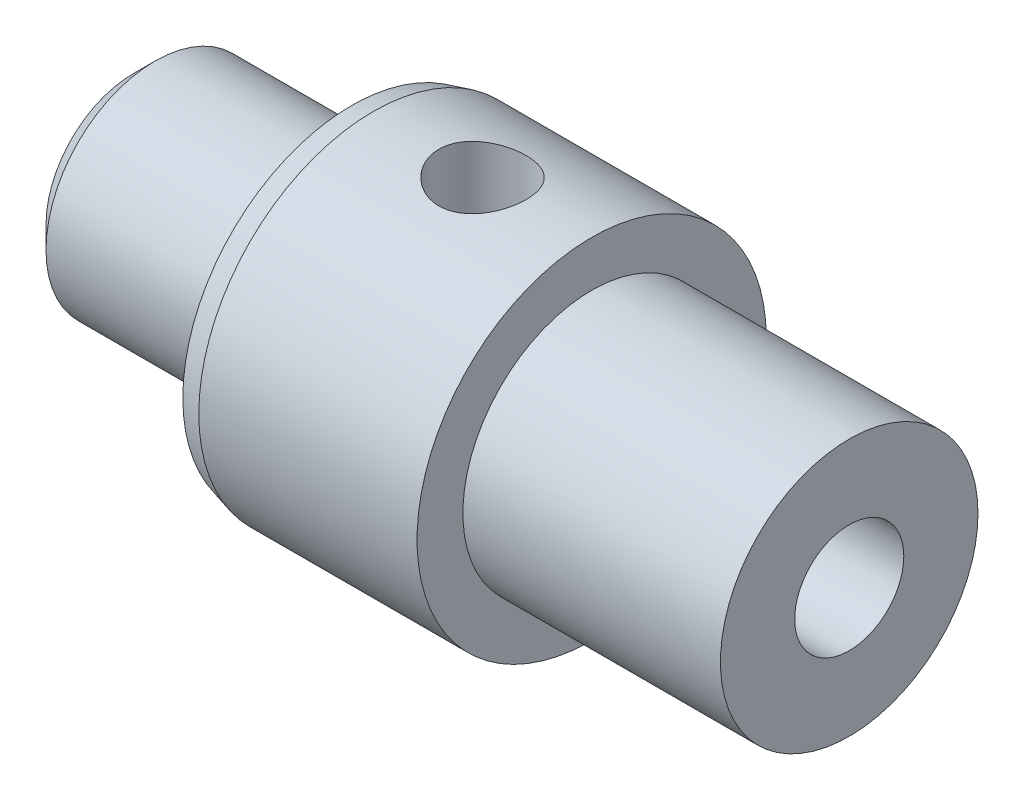
ISO-10303-21;
HEADER;
FILE_DESCRIPTION(('STEP AP214'),'2;1');
FILE_NAME('part.step','',(''),(''),'','','');
FILE_SCHEMA(('AUTOMOTIVE_DESIGN { 1 0 10303 214 1 1 1 1 }'));
ENDSEC;
DATA;
#1=APPLICATION_CONTEXT('core data for automotive mechanical design processes');
#2=APPLICATION_PROTOCOL_DEFINITION('international standard','automotive_design',2000,#1);
#3=PRODUCT_CONTEXT('',#1,'mechanical');
#4=PRODUCT('Part','Part','',(#3));
#5=PRODUCT_RELATED_PRODUCT_CATEGORY('part','',(#4));
#6=PRODUCT_DEFINITION_FORMATION('','',#4);
#7=PRODUCT_DEFINITION_CONTEXT('part definition',#1,'design');
#8=PRODUCT_DEFINITION('design','',#6,#7);
#9=PRODUCT_DEFINITION_SHAPE('','',#8);
#10=(LENGTH_UNIT() NAMED_UNIT(*) SI_UNIT(.MILLI.,.METRE.));
#11=(NAMED_UNIT(*) PLANE_ANGLE_UNIT() SI_UNIT($,.RADIAN.));
#12=(NAMED_UNIT(*) SI_UNIT($,.STERADIAN.) SOLID_ANGLE_UNIT());
#13=UNCERTAINTY_MEASURE_WITH_UNIT(LENGTH_MEASURE(1.E-05),#10,'distance_accuracy_value','');
#14=(GEOMETRIC_REPRESENTATION_CONTEXT(3) GLOBAL_UNCERTAINTY_ASSIGNED_CONTEXT((#13)) GLOBAL_UNIT_ASSIGNED_CONTEXT((#10,
#11,#12)) REPRESENTATION_CONTEXT('',''));
#15=CARTESIAN_POINT('',(0.,0.,0.));
#16=DIRECTION('',(0.,0.,1.));
#17=DIRECTION('',(1.,0.,0.));
#18=AXIS2_PLACEMENT_3D('',#15,#16,#17);
#19=CARTESIAN_POINT('',(10.5,0.,0.));
#20=DIRECTION('',(1.,0.,0.));
#21=DIRECTION('',(0.,0.,-1.));
#22=AXIS2_PLACEMENT_3D('',#19,#20,#21);
#23=PLANE('',#22);
#24=CARTESIAN_POINT('',(10.5,0.,0.));
#25=DIRECTION('',(1.,0.,0.));
#26=DIRECTION('',(0.,0.,-1.));
#27=AXIS2_PLACEMENT_3D('',#24,#25,#26);
#28=CIRCLE('',#27,4.);
#29=CARTESIAN_POINT('',(10.5,0.,-4.));
#30=VERTEX_POINT('',#29);
#31=EDGE_CURVE('E66',#30,#30,#28,.T.);
#32=ORIENTED_EDGE('',*,*,#31,.T.);
#33=EDGE_LOOP('',(#32));
#34=FACE_BOUND('',#33,.T.);
#35=CARTESIAN_POINT('',(10.5,0.,0.));
#36=DIRECTION('',(1.,0.,0.));
#37=DIRECTION('',(0.,0.,-1.));
#38=AXIS2_PLACEMENT_3D('',#35,#36,#37);
#39=CIRCLE('',#38,2.95);
#40=CARTESIAN_POINT('',(10.5,0.,-2.95));
#41=VERTEX_POINT('',#40);
#42=EDGE_CURVE('E52',#41,#41,#39,.T.);
#43=ORIENTED_EDGE('',*,*,#42,.F.);
#44=EDGE_LOOP('',(#43));
#45=FACE_BOUND('',#44,.T.);
#46=ADVANCED_FACE('F32',(#34,#45),#23,.T.);
#47=CARTESIAN_POINT('',(5.,4.,0.));
#48=DIRECTION('',(-1.,0.,0.));
#49=DIRECTION('',(0.,0.,1.));
#50=AXIS2_PLACEMENT_3D('',#47,#48,#49);
#51=PLANE('',#50);
#52=CARTESIAN_POINT('',(5.,0.,0.));
#53=DIRECTION('',(-1.,0.,0.));
#54=DIRECTION('',(0.,0.,1.));
#55=AXIS2_PLACEMENT_3D('',#52,#53,#54);
#56=CIRCLE('',#55,3.86602540400003);
#57=CARTESIAN_POINT('',(5.,0.,3.86602540400003));
#58=VERTEX_POINT('',#57);
#59=EDGE_CURVE('E11',#58,#58,#56,.T.);
#60=ORIENTED_EDGE('',*,*,#59,.T.);
#61=EDGE_LOOP('',(#60));
#62=FACE_BOUND('',#61,.T.);
#63=CARTESIAN_POINT('',(5.,0.,0.));
#64=DIRECTION('',(-1.,0.,0.));
#65=DIRECTION('',(0.,0.,1.));
#66=AXIS2_PLACEMENT_3D('',#63,#64,#65);
#67=CIRCLE('',#66,2.5);
#68=CARTESIAN_POINT('',(5.,0.,2.5));
#69=VERTEX_POINT('',#68);
#70=EDGE_CURVE('E62',#69,#69,#67,.T.);
#71=ORIENTED_EDGE('',*,*,#70,.F.);
#72=EDGE_LOOP('',(#71));
#73=FACE_BOUND('',#72,.T.);
#74=ADVANCED_FACE('F106',(#62,#73),#51,.T.);
#75=CARTESIAN_POINT('',(5.,0.,0.));
#76=DIRECTION('',(1.,0.,0.));
#77=DIRECTION('',(0.,0.,-1.));
#78=AXIS2_PLACEMENT_3D('',#75,#76,#77);
#79=CYLINDRICAL_SURFACE('',#78,4.);
#80=CARTESIAN_POINT('',(5.49999999999986,0.,0.));
#81=DIRECTION('',(-1.,0.,0.));
#82=DIRECTION('',(0.,0.,1.));
#83=AXIS2_PLACEMENT_3D('',#80,#81,#82);
#84=CIRCLE('',#83,4.);
#85=CARTESIAN_POINT('',(5.49999999999986,0.,4.));
#86=VERTEX_POINT('',#85);
#87=EDGE_CURVE('E39',#86,#86,#84,.F.);
#88=ORIENTED_EDGE('',*,*,#87,.T.);
#89=EDGE_LOOP('',(#88));
#90=FACE_BOUND('',#89,.T.);
#91=CARTESIAN_POINT('',(8.99999999999999,4.00000000000001,0.));
#92=CARTESIAN_POINT('',(8.99999844950788,3.99999906578676,-0.05525072577982));
#93=CARTESIAN_POINT('',(8.99540563281746,3.99884385421219,-0.110518771887174));
#94=CARTESIAN_POINT('',(8.97718323246199,3.99434742553261,-0.219470882513686));
#95=CARTESIAN_POINT('',(8.96354852697476,3.99100496946646,-0.273154031247156));
#96=CARTESIAN_POINT('',(8.9277071643586,3.98250417554693,-0.377347248121714));
#97=CARTESIAN_POINT('',(8.90551080085647,3.97734801894725,-0.427861042286664));
#98=CARTESIAN_POINT('',(8.85321240663677,3.96576895871729,-0.524448087936278));
#99=CARTESIAN_POINT('',(8.82311010925403,3.95934601236034,-0.570521189565833));
#100=CARTESIAN_POINT('',(8.75519947356385,3.94578275727868,-0.657867951533939));
#101=CARTESIAN_POINT('',(8.7172589500272,3.93863138099022,-0.699037126707374));
#102=CARTESIAN_POINT('',(8.63503186339405,3.92449080078353,-0.774499284802194));
#103=CARTESIAN_POINT('',(8.59074458470233,3.91750161525566,-0.808791491299414));
#104=CARTESIAN_POINT('',(8.4962698488417,3.9043651713314,-0.870017695199344));
#105=CARTESIAN_POINT('',(8.44600451279306,3.89823196313737,-0.896834810616894));
#106=CARTESIAN_POINT('',(8.34150105889442,3.88766329874816,-0.941597939033674));
#107=CARTESIAN_POINT('',(8.28726357778282,3.88322757115193,-0.959545370292877));
#108=CARTESIAN_POINT('',(8.17750433453168,3.87666984478368,-0.985703224536181));
#109=CARTESIAN_POINT('',(8.12203006930013,3.87450327383618,-0.994101512222213));
#110=CARTESIAN_POINT('',(8.01042095399068,3.87259575025161,-1.00150785004522));
#111=CARTESIAN_POINT('',(7.95428621286759,3.87285440299096,-1.00051742787864));
#112=CARTESIAN_POINT('',(7.84438946150368,3.87572803664412,-0.989324349759508));
#113=CARTESIAN_POINT('',(7.79060291902327,3.87828575334586,-0.979345560127001));
#114=CARTESIAN_POINT('',(7.68549263272581,3.88537806450989,-0.950816124602059));
#115=CARTESIAN_POINT('',(7.63416906464735,3.88991279980464,-0.932264868046271));
#116=CARTESIAN_POINT('',(7.53484132249863,3.90050075936125,-0.886926318624759));
#117=CARTESIAN_POINT('',(7.48687588547364,3.90656884979614,-0.860057778155264));
#118=CARTESIAN_POINT('',(7.39605419349545,3.91953140564258,-0.79890418400996));
#119=CARTESIAN_POINT('',(7.35319883462184,3.9264260155649,-0.764617832539216));
#120=CARTESIAN_POINT('',(7.27253092287041,3.94050587026521,-0.688442283120803));
#121=CARTESIAN_POINT('',(7.23489700662578,3.94769379651981,-0.646364172110565));
#122=CARTESIAN_POINT('',(7.16718583835741,3.96137310385857,-0.556407945002459));
#123=CARTESIAN_POINT('',(7.13710881715763,3.96786446366277,-0.508529651805289));
#124=CARTESIAN_POINT('',(7.08529960918375,3.97945154729455,-0.408077259120922));
#125=CARTESIAN_POINT('',(7.06359643983039,3.9845424008515,-0.355487595472411));
#126=CARTESIAN_POINT('',(7.0293884628603,3.99271944660946,-0.247250672095252));
#127=CARTESIAN_POINT('',(7.01688189572125,3.99580602226187,-0.191603999433654));
#128=CARTESIAN_POINT('',(7.00169495629412,3.9995699951425,-0.0803599802600163));
#129=CARTESIAN_POINT('',(6.99877131594981,4.00030702338852,-0.0247978133254723));
#130=CARTESIAN_POINT('',(7.00216600137034,3.999458698763,0.0860219165343384));
#131=CARTESIAN_POINT('',(7.00848349519943,3.99787355494564,0.141279506429729));
#132=CARTESIAN_POINT('',(7.02998060559427,3.99259720751571,0.249076179184326));
#133=CARTESIAN_POINT('',(7.04502750898467,3.98893756123874,0.301643412645834));
#134=CARTESIAN_POINT('',(7.08340472268564,3.97992471089423,0.403504861635004));
#135=CARTESIAN_POINT('',(7.10673586954212,3.97457133579928,0.452798746021752));
#136=CARTESIAN_POINT('',(7.16149075258316,3.96262205284207,0.547682089619893));
#137=CARTESIAN_POINT('',(7.19305074159785,3.95600578244621,0.593190294557214));
#138=CARTESIAN_POINT('',(7.26319327253132,3.94229672791613,0.678351075762156));
#139=CARTESIAN_POINT('',(7.30177702641128,3.93520386167803,0.718002639315331));
#140=CARTESIAN_POINT('',(7.38600130722965,3.92112637973848,0.791327045381811));
#141=CARTESIAN_POINT('',(7.43179180200162,3.91414869458187,0.824829245081345));
#142=CARTESIAN_POINT('',(7.52848842297715,3.90128585584826,0.883673839341788));
#143=CARTESIAN_POINT('',(7.57939432197317,3.89540065378018,0.90901659610528));
#144=CARTESIAN_POINT('',(7.68460381494206,3.88545396489777,0.950634280406184));
#145=CARTESIAN_POINT('',(7.73888508556268,3.88138170194604,0.966962931102699));
#146=CARTESIAN_POINT('',(7.84953975859274,3.87551162726789,0.990230439969174));
#147=CARTESIAN_POINT('',(7.90591270068833,3.87371331813291,0.997171351652426));
#148=CARTESIAN_POINT('',(8.01741401590347,3.87263267469305,1.00135906022265));
#149=CARTESIAN_POINT('',(8.07253162341649,3.87327955152176,0.998878598520066));
#150=CARTESIAN_POINT('',(8.18153592577865,3.87685272671895,0.984918185541899));
#151=CARTESIAN_POINT('',(8.23542264534243,3.87977897927905,0.973438415124501));
#152=CARTESIAN_POINT('',(8.34013897271027,3.88754173788482,0.941954212961851));
#153=CARTESIAN_POINT('',(8.39098487016013,3.89236676824206,0.922000936453572));
#154=CARTESIAN_POINT('',(8.48864358847579,3.90338503816553,0.874176609070036));
#155=CARTESIAN_POINT('',(8.53545584879127,3.90957846747182,0.846304460022782));
#156=CARTESIAN_POINT('',(8.62503641933467,3.92283756175675,0.782578499091414));
#157=CARTESIAN_POINT('',(8.66766738228263,3.92992176554505,0.746535441941493));
#158=CARTESIAN_POINT('',(8.74636469653026,3.94405351497524,0.667859580793147));
#159=CARTESIAN_POINT('',(8.78242948674197,3.95110105151373,0.625225214174087));
#160=CARTESIAN_POINT('',(8.84760753904306,3.96451770431775,0.533645057801718));
#161=CARTESIAN_POINT('',(8.87658307578104,3.97087222243912,0.484598948210916));
#162=CARTESIAN_POINT('',(8.92583164196034,3.98203283316746,0.382177373006978));
#163=CARTESIAN_POINT('',(8.94611090709901,3.98684003466521,0.328805042291154));
#164=CARTESIAN_POINT('',(8.97438122021976,3.99365373043694,0.229606835495643));
#165=CARTESIAN_POINT('',(8.98396749536894,3.9960172336846,0.184253447272042));
#166=CARTESIAN_POINT('',(8.99677729574795,3.99919070154632,0.0926040476908534));
#167=CARTESIAN_POINT('',(9.00000129953686,4.00000078300597,0.0463081074950765));
#168=CARTESIAN_POINT('',(8.99999999999999,4.00000000000001,0.));
#169=B_SPLINE_CURVE_WITH_KNOTS('',3,(#91,#92,#93,#94,#95,#96,#97,#98,#99,#100,#101,#102,#103,
#104,#105,#106,#107,#108,#109,#110,#111,#112,#113,#114,#115,#116,#117,#118,#119,#120,#121,#122,
#123,#124,#125,#126,#127,#128,#129,#130,#131,#132,#133,#134,#135,#136,#137,#138,#139,#140,#141,
#142,#143,#144,#145,#146,#147,#148,#149,#150,#151,#152,#153,#154,#155,#156,#157,#158,#159,#160,
#161,#162,#163,#164,#165,#166,#167,#168),.UNSPECIFIED.,.T.,.F.,(4,2,2,2,2,2,2,2,2,2,2,2,2,2,2,2,
2,2,2,2,2,2,2,2,2,2,2,2,2,2,2,2,2,2,2,2,2,2,4),(0.,0.165582474981258,0.331258825175929,
0.496736601524066,0.662219960112878,0.830762902914251,0.999324863867068,1.1703909836387,
1.34142974112911,1.50904196732952,1.67662692075129,1.84014998004677,2.00368468977357,
2.16887018582583,2.33408460557439,2.5040100064601,2.67394059705495,2.84445486006073,
3.01493649125758,3.18105539299514,3.34715934075158,3.51080183009354,3.67446084881523,
3.8410239171023,4.00761575338674,4.17829672802979,4.34897012499667,4.51861503076019,
4.68822282168266,4.85295853599069,5.01769093970683,5.18144267039625,5.34521712091261,
5.51326384273267,5.68135046513605,5.85248123666385,6.02348909214226,6.16228161961425,
6.30106370695352),.UNSPECIFIED.);
#170=CARTESIAN_POINT('',(8.99999999999999,4.00000000000001,0.));
#171=VERTEX_POINT('',#170);
#172=EDGE_CURVE('E76',#171,#171,#169,.T.);
#173=ORIENTED_EDGE('',*,*,#172,.F.);
#174=EDGE_LOOP('',(#173));
#175=FACE_BOUND('',#174,.T.);
#176=CARTESIAN_POINT('',(8.,-3.87298334620742,-0.999999999999988));
#177=CARTESIAN_POINT('',(8.05522030035679,-3.87298440057185,-0.999998431438687));
#178=CARTESIAN_POINT('',(8.11045795943136,-3.87417722499279,-0.995410498208057));
#179=CARTESIAN_POINT('',(8.21934703123261,-3.87880744892249,-0.977209250194434));
#180=CARTESIAN_POINT('',(8.27299750177996,-3.88224615474181,-0.963590682698065));
#181=CARTESIAN_POINT('',(8.37712141528784,-3.89095489813012,-0.927796479849623));
#182=CARTESIAN_POINT('',(8.42759886215775,-3.8962225706936,-0.905631891140932));
#183=CARTESIAN_POINT('',(8.52412434101247,-3.90799276818327,-0.853408456505396));
#184=CARTESIAN_POINT('',(8.57017218483114,-3.91449534553241,-0.823349275424494));
#185=CARTESIAN_POINT('',(8.65754465810584,-3.92816286540368,-0.755483370924507));
#186=CARTESIAN_POINT('',(8.69875744014027,-3.93533839048709,-0.717534755081548));
#187=CARTESIAN_POINT('',(8.77430455774387,-3.94945150206622,-0.63527282564032));
#188=CARTESIAN_POINT('',(8.80863825024862,-3.95638906626692,-0.590958917672131));
#189=CARTESIAN_POINT('',(8.86991018705257,-3.96936166208095,-0.496458080431557));
#190=CARTESIAN_POINT('',(8.89673855526459,-3.975382749602,-0.446197830478036));
#191=CARTESIAN_POINT('',(8.9415238576612,-3.9857232477043,-0.341705273717104));
#192=CARTESIAN_POINT('',(8.95948210076619,-3.99004290933747,-0.287473554316773));
#193=CARTESIAN_POINT('',(8.98565913383143,-3.99641903539262,-0.17774350350166));
#194=CARTESIAN_POINT('',(8.99406785773062,-3.99851957537723,-0.122293087819587));
#195=CARTESIAN_POINT('',(9.00150335171021,-4.00037437642922,-0.0107315277051063));
#196=CARTESIAN_POINT('',(9.00053150888383,-4.00012898438682,0.0453795178152285));
#197=CARTESIAN_POINT('',(8.98937005989993,-3.99735237981413,0.155352247172387));
#198=CARTESIAN_POINT('',(8.97938546997845,-3.99487200936349,0.209236215601067));
#199=CARTESIAN_POINT('',(8.95081149198059,-3.98796334609942,0.314538247413685));
#200=CARTESIAN_POINT('',(8.93222164584902,-3.98353494959376,0.365956179370436));
#201=CARTESIAN_POINT('',(8.88679897172516,-3.97315003880358,0.465406703501803));
#202=CARTESIAN_POINT('',(8.85989318213529,-3.96718007878021,0.5134045097665));
#203=CARTESIAN_POINT('',(8.79865772835349,-3.9543596152386,0.604275622340483));
#204=CARTESIAN_POINT('',(8.76432677257574,-3.94750895860996,0.647148035085499));
#205=CARTESIAN_POINT('',(8.68811650320704,-3.93345485507808,0.727774035084949));
#206=CARTESIAN_POINT('',(8.64605804306088,-3.92624687810367,0.765357679075191));
#207=CARTESIAN_POINT('',(8.55616001058389,-3.91246017406683,0.83297637596301));
#208=CARTESIAN_POINT('',(8.50832016820359,-3.90588147642388,0.863011076046007));
#209=CARTESIAN_POINT('',(8.40788398634041,-3.8940819873266,0.914788129022588));
#210=CARTESIAN_POINT('',(8.35526570787472,-3.88886793490289,0.93648956697048));
#211=CARTESIAN_POINT('',(8.24696581276941,-3.88047456055983,0.970685620636329));
#212=CARTESIAN_POINT('',(8.19128485440674,-3.87729480324088,0.983182206552898));
#213=CARTESIAN_POINT('',(8.08001619939075,-3.87342142415657,0.998331855466059));
#214=CARTESIAN_POINT('',(8.02446488266814,-3.8726643563746,1.00123618956784));
#215=CARTESIAN_POINT('',(7.91367122536873,-3.87354937392416,0.997806796206206));
#216=CARTESIAN_POINT('',(7.8584288568195,-3.87519123840507,0.991473919139507));
#217=CARTESIAN_POINT('',(7.75075429401812,-3.88062832781824,0.969970185575052));
#218=CARTESIAN_POINT('',(7.69829090937166,-3.8843878809375,0.954945627312686));
#219=CARTESIAN_POINT('',(7.59662741685933,-3.89360287308385,0.916647232668236));
#220=CARTESIAN_POINT('',(7.54742769637787,-3.89905851299446,0.893372419085006));
#221=CARTESIAN_POINT('',(7.45262348885306,-3.91118454837305,0.838708267174611));
#222=CARTESIAN_POINT('',(7.40710846398276,-3.91787667442657,0.80716870153424));
#223=CARTESIAN_POINT('',(7.32192465487947,-3.93166833228687,0.737060292934445));
#224=CARTESIAN_POINT('',(7.28225683333998,-3.93876793091388,0.698490294805429));
#225=CARTESIAN_POINT('',(7.20887558297162,-3.95278961212643,0.614262720984716));
#226=CARTESIAN_POINT('',(7.17533597498048,-3.95970280824734,0.568451952531583));
#227=CARTESIAN_POINT('',(7.11642565321951,-3.97238886645494,0.471702682694667));
#228=CARTESIAN_POINT('',(7.09105451335673,-3.97816178801584,0.420764448957584));
#229=CARTESIAN_POINT('',(7.04942158618884,-3.98788046295326,0.315558201731084));
#230=CARTESIAN_POINT('',(7.03309428624839,-3.99183932008964,0.261317381027876));
#231=CARTESIAN_POINT('',(7.00981586615664,-3.99754117358315,0.150749760318804));
#232=CARTESIAN_POINT('',(7.00286293650439,-3.99928459757363,0.09442336504124));
#233=CARTESIAN_POINT('',(6.99863241042448,-4.00034169408811,-0.0170835264433287));
#234=CARTESIAN_POINT('',(7.00109829090462,-3.99971978880008,-0.0722538269660348));
#235=CARTESIAN_POINT('',(7.01504782729434,-3.99625896457423,-0.18136749641474));
#236=CARTESIAN_POINT('',(7.02653121501312,-3.99342011157094,-0.235310901780886));
#237=CARTESIAN_POINT('',(7.05805221977094,-3.98585432853963,-0.340171035644814));
#238=CARTESIAN_POINT('',(7.07804345331464,-3.98113764502669,-0.391102494581017));
#239=CARTESIAN_POINT('',(7.12597057901934,-3.97031288913382,-0.488917053041465));
#240=CARTESIAN_POINT('',(7.15390747266958,-3.96420464137727,-0.535799641265047));
#241=CARTESIAN_POINT('',(7.21771523399708,-3.95107249681342,-0.625401928423895));
#242=CARTESIAN_POINT('',(7.25376014290738,-3.94403016945647,-0.667994988300581));
#243=CARTESIAN_POINT('',(7.33242285197382,-3.92990649053207,-0.746615020271245));
#244=CARTESIAN_POINT('',(7.37504231609795,-3.92282512952424,-0.78264032506817));
#245=CARTESIAN_POINT('',(7.4666014142013,-3.90927475860683,-0.847762026479231));
#246=CARTESIAN_POINT('',(7.51564412341249,-3.90281963730391,-0.876716619446584));
#247=CARTESIAN_POINT('',(7.61805548992285,-3.8914395555011,-0.925926896615611));
#248=CARTESIAN_POINT('',(7.67142096610729,-3.88651348244815,-0.946188909759546));
#249=CARTESIAN_POINT('',(7.77057701182628,-3.87951908741315,-0.97442252856556));
#250=CARTESIAN_POINT('',(7.81589316438236,-3.87708663005762,-0.983993170595817));
#251=CARTESIAN_POINT('',(7.90746886900147,-3.87381838580358,-0.996782292572807));
#252=CARTESIAN_POINT('',(7.95372834025063,-3.87298246270639,-1.00000131437051));
#253=CARTESIAN_POINT('',(8.,-3.87298334620742,-0.999999999999988));
#254=B_SPLINE_CURVE_WITH_KNOTS('',3,(#176,#177,#178,#179,#180,#181,#182,#183,#184,#185,#186,
#187,#188,#189,#190,#191,#192,#193,#194,#195,#196,#197,#198,#199,#200,#201,#202,#203,#204,#205,
#206,#207,#208,#209,#210,#211,#212,#213,#214,#215,#216,#217,#218,#219,#220,#221,#222,#223,#224,
#225,#226,#227,#228,#229,#230,#231,#232,#233,#234,#235,#236,#237,#238,#239,#240,#241,#242,#243,
#244,#245,#246,#247,#248,#249,#250,#251,#252,#253),.UNSPECIFIED.,.T.,.F.,(4,2,2,2,2,2,2,2,2,2,2,
2,2,2,2,2,2,2,2,2,2,2,2,2,2,2,2,2,2,2,2,2,2,2,2,2,2,2,4),(0.,0.165490976675229,
0.331078296534208,0.496452290829148,0.661833306984651,0.830495816734639,0.9991740858822,
1.17020598555441,1.3412126393511,1.50875500394411,1.67627259462681,1.84007305071851,
2.00388222686187,2.1691714969805,2.33448954183837,2.50428186625036,2.67408212476192,
2.84470572799632,3.0152928004809,3.18137429900958,3.34744050869791,3.51078961999953,
3.67415808564837,3.84073138339933,4.00733207550288,4.17810132382397,4.34886166284091,
4.51836829119041,4.68784219559884,4.85273378447251,5.01762046947061,5.18161950620153,
5.34563922291497,5.51358838629096,5.68158012622471,5.85270590910138,6.02370688542915,
6.16239130867199,6.30106390036075),.UNSPECIFIED.);
#255=CARTESIAN_POINT('',(8.,-3.87298334620742,-0.999999999999988));
#256=VERTEX_POINT('',#255);
#257=EDGE_CURVE('E69',#256,#256,#254,.T.);
#258=ORIENTED_EDGE('',*,*,#257,.F.);
#259=EDGE_LOOP('',(#258));
#260=FACE_BOUND('',#259,.T.);
#261=ORIENTED_EDGE('',*,*,#31,.F.);
#262=EDGE_LOOP('',(#261));
#263=FACE_BOUND('',#262,.T.);
#264=ADVANCED_FACE('F80',(#90,#175,#260,#263),#79,.T.);
#265=CARTESIAN_POINT('',(0.,0.,0.));
#266=DIRECTION('',(1.,0.,0.));
#267=DIRECTION('',(0.,0.,-1.));
#268=AXIS2_PLACEMENT_3D('',#265,#266,#267);
#269=CYLINDRICAL_SURFACE('',#268,2.5);
#270=CARTESIAN_POINT('',(0.500000000000072,0.,0.));
#271=DIRECTION('',(-1.,0.,0.));
#272=DIRECTION('',(0.,0.,1.));
#273=AXIS2_PLACEMENT_3D('',#270,#271,#272);
#274=CIRCLE('',#273,2.5);
#275=CARTESIAN_POINT('',(0.500000000000072,0.,2.5));
#276=VERTEX_POINT('',#275);
#277=EDGE_CURVE('E124',#276,#276,#274,.F.);
#278=ORIENTED_EDGE('',*,*,#277,.T.);
#279=EDGE_LOOP('',(#278));
#280=FACE_BOUND('',#279,.T.);
#281=ORIENTED_EDGE('',*,*,#70,.T.);
#282=EDGE_LOOP('',(#281));
#283=FACE_BOUND('',#282,.T.);
#284=ADVANCED_FACE('F100',(#280,#283),#269,.T.);
#285=CARTESIAN_POINT('',(0.,0.,0.));
#286=DIRECTION('',(-1.,0.,0.));
#287=DIRECTION('',(0.,0.,1.));
#288=AXIS2_PLACEMENT_3D('',#285,#286,#287);
#289=PLANE('',#288);
#290=CARTESIAN_POINT('',(0.,0.,0.));
#291=DIRECTION('',(-1.,0.,0.));
#292=DIRECTION('',(0.,0.,1.));
#293=AXIS2_PLACEMENT_3D('',#290,#291,#292);
#294=CIRCLE('',#293,1.99999999999993);
#295=CARTESIAN_POINT('',(0.,0.,1.99999999999993));
#296=VERTEX_POINT('',#295);
#297=EDGE_CURVE('E126',#296,#296,#294,.T.);
#298=ORIENTED_EDGE('',*,*,#297,.T.);
#299=EDGE_LOOP('',(#298));
#300=FACE_BOUND('',#299,.T.);
#301=ADVANCED_FACE('F96',(#300),#289,.T.);
#302=CARTESIAN_POINT('',(16.4,0.,0.));
#303=DIRECTION('',(-1.,0.,0.));
#304=DIRECTION('',(0.,0.,1.));
#305=AXIS2_PLACEMENT_3D('',#302,#303,#304);
#306=CYLINDRICAL_SURFACE('',#305,2.95);
#307=CARTESIAN_POINT('',(16.4,0.,0.));
#308=DIRECTION('',(1.,0.,0.));
#309=DIRECTION('',(0.,0.,-1.));
#310=AXIS2_PLACEMENT_3D('',#307,#308,#309);
#311=CIRCLE('',#310,2.95);
#312=CARTESIAN_POINT('',(16.4,0.,-2.95));
#313=VERTEX_POINT('',#312);
#314=EDGE_CURVE('E56',#313,#313,#311,.T.);
#315=ORIENTED_EDGE('',*,*,#314,.F.);
#316=EDGE_LOOP('',(#315));
#317=FACE_BOUND('',#316,.T.);
#318=ORIENTED_EDGE('',*,*,#42,.T.);
#319=EDGE_LOOP('',(#318));
#320=FACE_BOUND('',#319,.T.);
#321=ADVANCED_FACE('F92',(#317,#320),#306,.T.);
#322=CARTESIAN_POINT('',(16.4,0.,0.));
#323=DIRECTION('',(1.,0.,0.));
#324=DIRECTION('',(0.,0.,-1.));
#325=AXIS2_PLACEMENT_3D('',#322,#323,#324);
#326=PLANE('',#325);
#327=CARTESIAN_POINT('',(16.4,0.,0.));
#328=DIRECTION('',(1.,0.,0.));
#329=DIRECTION('',(0.,0.,-1.));
#330=AXIS2_PLACEMENT_3D('',#327,#328,#329);
#331=CIRCLE('',#330,1.25);
#332=CARTESIAN_POINT('',(16.4,0.,-1.25));
#333=VERTEX_POINT('',#332);
#334=EDGE_CURVE('E53',#333,#333,#331,.T.);
#335=ORIENTED_EDGE('',*,*,#334,.F.);
#336=EDGE_LOOP('',(#335));
#337=FACE_BOUND('',#336,.T.);
#338=ORIENTED_EDGE('',*,*,#314,.T.);
#339=EDGE_LOOP('',(#338));
#340=FACE_BOUND('',#339,.T.);
#341=ADVANCED_FACE('F86',(#337,#340),#326,.T.);
#342=CARTESIAN_POINT('',(8.,-4.,0.));
#343=DIRECTION('',(0.,-1.,0.));
#344=DIRECTION('',(0.,0.,-1.));
#345=AXIS2_PLACEMENT_3D('',#342,#343,#344);
#346=CYLINDRICAL_SURFACE('',#345,0.999999999999988);
#347=ORIENTED_EDGE('',*,*,#172,.T.);
#348=EDGE_LOOP('',(#347));
#349=FACE_BOUND('',#348,.T.);
#350=ORIENTED_EDGE('',*,*,#257,.T.);
#351=EDGE_LOOP('',(#350));
#352=FACE_BOUND('',#351,.T.);
#353=ADVANCED_FACE('F46',(#349,#352),#346,.F.);
#354=CARTESIAN_POINT('',(10.4,0.,0.));
#355=DIRECTION('',(1.,0.,0.));
#356=DIRECTION('',(0.,0.,-1.));
#357=AXIS2_PLACEMENT_3D('',#354,#355,#356);
#358=CONICAL_SURFACE('',#357,1.25,1.02974425867665);
#359=CARTESIAN_POINT('',(9.64892422621555,0.,0.));
#360=VERTEX_POINT('',#359);
#361=VERTEX_LOOP('',#360);
#362=FACE_BOUND('',#361,.T.);
#363=CARTESIAN_POINT('',(10.4,0.,0.));
#364=DIRECTION('',(1.,0.,0.));
#365=DIRECTION('',(0.,0.,-1.));
#366=AXIS2_PLACEMENT_3D('',#363,#364,#365);
#367=CIRCLE('',#366,1.25);
#368=CARTESIAN_POINT('',(10.4,0.,-1.25));
#369=VERTEX_POINT('',#368);
#370=EDGE_CURVE('E50',#369,#369,#367,.T.);
#371=ORIENTED_EDGE('',*,*,#370,.T.);
#372=EDGE_LOOP('',(#371));
#373=FACE_BOUND('',#372,.T.);
#374=ADVANCED_FACE('F42',(#362,#373),#358,.F.);
#375=CARTESIAN_POINT('',(16.4,0.,0.));
#376=DIRECTION('',(1.,0.,0.));
#377=DIRECTION('',(0.,0.,-1.));
#378=AXIS2_PLACEMENT_3D('',#375,#376,#377);
#379=CYLINDRICAL_SURFACE('',#378,1.25);
#380=ORIENTED_EDGE('',*,*,#370,.F.);
#381=EDGE_LOOP('',(#380));
#382=FACE_BOUND('',#381,.T.);
#383=ORIENTED_EDGE('',*,*,#334,.T.);
#384=EDGE_LOOP('',(#383));
#385=FACE_BOUND('',#384,.T.);
#386=ADVANCED_FACE('F45',(#382,#385),#379,.F.);
#387=CARTESIAN_POINT('',(0.,0.,0.));
#388=DIRECTION('',(1.,0.,0.));
#389=DIRECTION('',(0.,0.,-1.));
#390=AXIS2_PLACEMENT_3D('',#387,#388,#389);
#391=CONICAL_SURFACE('',#390,1.99999999999993,0.785398163397444);
#392=ORIENTED_EDGE('',*,*,#277,.F.);
#393=EDGE_LOOP('',(#392));
#394=FACE_BOUND('',#393,.T.);
#395=ORIENTED_EDGE('',*,*,#297,.F.);
#396=EDGE_LOOP('',(#395));
#397=FACE_BOUND('',#396,.T.);
#398=ADVANCED_FACE('F121',(#394,#397),#391,.T.);
#399=CARTESIAN_POINT('',(5.49999999999986,0.,0.));
#400=DIRECTION('',(1.,0.,0.));
#401=DIRECTION('',(0.,0.,-1.));
#402=AXIS2_PLACEMENT_3D('',#399,#400,#401);
#403=CONICAL_SURFACE('',#402,4.,0.261799387396916);
#404=ORIENTED_EDGE('',*,*,#59,.F.);
#405=EDGE_LOOP('',(#404));
#406=FACE_BOUND('',#405,.T.);
#407=ORIENTED_EDGE('',*,*,#87,.F.);
#408=EDGE_LOOP('',(#407));
#409=FACE_BOUND('',#408,.T.);
#410=ADVANCED_FACE('F34',(#406,#409),#403,.T.);
#411=CLOSED_SHELL('',(#46,#74,#264,#284,#301,#321,#341,#353,#374,#386,#398,#410));
#412=MANIFOLD_SOLID_BREP('B2',#411);
#413=ADVANCED_BREP_SHAPE_REPRESENTATION('',(#18,#412),#14);
#414=SHAPE_DEFINITION_REPRESENTATION(#9,#413);
ENDSEC;
END-ISO-10303-21;
